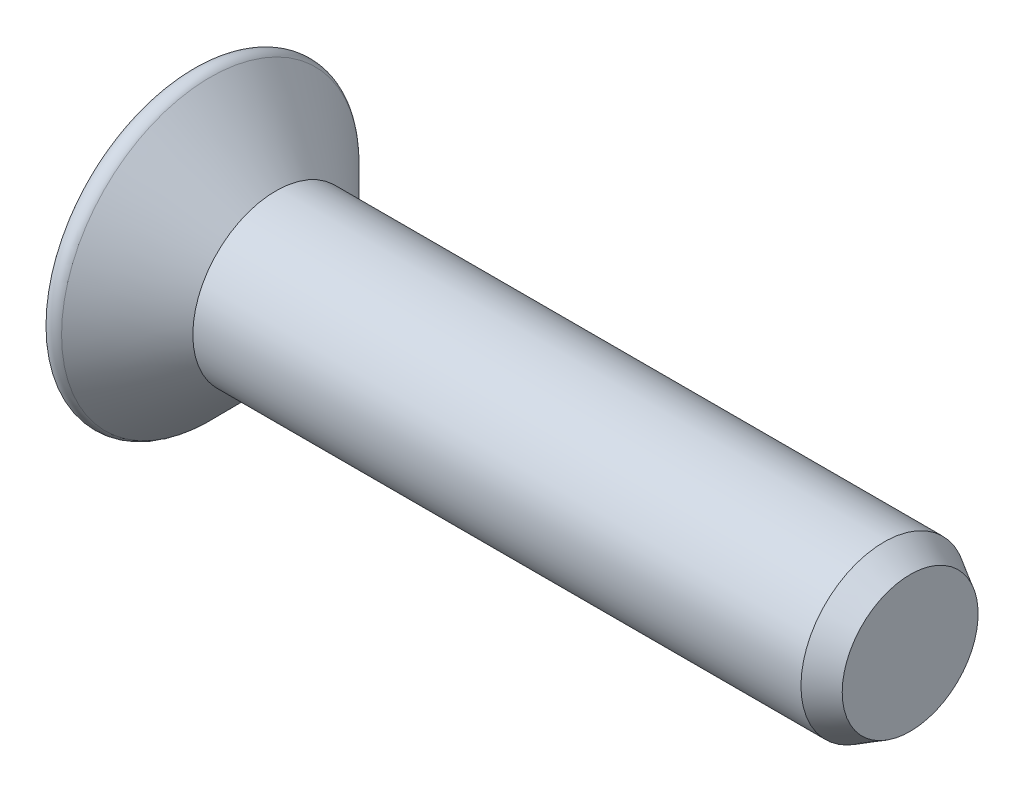
ISO-10303-21;
HEADER;
FILE_DESCRIPTION(('STEP AP214'),'2;1');
FILE_NAME('part.step','',(''),(''),'','','');
FILE_SCHEMA(('AUTOMOTIVE_DESIGN { 1 0 10303 214 1 1 1 1 }'));
ENDSEC;
DATA;
#1=APPLICATION_CONTEXT('core data for automotive mechanical design processes');
#2=APPLICATION_PROTOCOL_DEFINITION('international standard','automotive_design',2000,#1);
#3=PRODUCT_CONTEXT('',#1,'mechanical');
#4=PRODUCT('Part','Part','',(#3));
#5=PRODUCT_RELATED_PRODUCT_CATEGORY('part','',(#4));
#6=PRODUCT_DEFINITION_FORMATION('','',#4);
#7=PRODUCT_DEFINITION_CONTEXT('part definition',#1,'design');
#8=PRODUCT_DEFINITION('design','',#6,#7);
#9=PRODUCT_DEFINITION_SHAPE('','',#8);
#10=(LENGTH_UNIT() NAMED_UNIT(*) SI_UNIT(.MILLI.,.METRE.));
#11=(NAMED_UNIT(*) PLANE_ANGLE_UNIT() SI_UNIT($,.RADIAN.));
#12=(NAMED_UNIT(*) SI_UNIT($,.STERADIAN.) SOLID_ANGLE_UNIT());
#13=UNCERTAINTY_MEASURE_WITH_UNIT(LENGTH_MEASURE(1.E-05),#10,'distance_accuracy_value','');
#14=(GEOMETRIC_REPRESENTATION_CONTEXT(3) GLOBAL_UNCERTAINTY_ASSIGNED_CONTEXT((#13)) GLOBAL_UNIT_ASSIGNED_CONTEXT((#10,
#11,#12)) REPRESENTATION_CONTEXT('',''));
#15=CARTESIAN_POINT('',(0.,0.,0.));
#16=DIRECTION('',(0.,0.,1.));
#17=DIRECTION('',(1.,0.,0.));
#18=AXIS2_PLACEMENT_3D('',#15,#16,#17);
#19=CARTESIAN_POINT('',(2.4,0.,0.));
#20=DIRECTION('',(-1.,0.,0.));
#21=DIRECTION('',(0.,1.,0.));
#22=AXIS2_PLACEMENT_3D('',#19,#20,#21);
#23=SPHERICAL_SURFACE('',#22,4.);
#24=CARTESIAN_POINT('',(-1.1,0.,0.));
#25=DIRECTION('',(-1.,0.,0.));
#26=DIRECTION('',(0.,0.,1.));
#27=AXIS2_PLACEMENT_3D('',#24,#25,#26);
#28=CIRCLE('',#27,1.93649167310371);
#29=CARTESIAN_POINT('',(-1.1,0.,1.93649167310371));
#30=VERTEX_POINT('',#29);
#31=EDGE_CURVE('E186',#30,#30,#28,.T.);
#32=ORIENTED_EDGE('',*,*,#31,.T.);
#33=EDGE_LOOP('',(#32));
#34=FACE_BOUND('',#33,.T.);
#35=CARTESIAN_POINT('',(2.35629520146761,0.0815496745064481,0.407748372532241));
#36=DIRECTION('',(0.104528463267654,-0.195041790429927,-0.975208952149636));
#37=DIRECTION('',(0.,0.98058067569092,-0.196116135138184));
#38=AXIS2_PLACEMENT_3D('',#35,#36,#37);
#39=CIRCLE('',#38,3.97808758147309);
#40=CARTESIAN_POINT('',(-1.44518808804125,1.08372861238356,-0.200152097882818));
#41=VERTEX_POINT('',#40);
#42=CARTESIAN_POINT('',(-1.52998706959774,0.732056357032629,-0.138906885800055));
#43=VERTEX_POINT('',#42);
#44=EDGE_CURVE('E11',#41,#43,#39,.F.);
#45=ORIENTED_EDGE('',*,*,#44,.F.);
#46=CARTESIAN_POINT('',(2.47064663141738,0.672157798768073,0.));
#47=DIRECTION('',(0.104528463267654,0.994521895368273,0.));
#48=DIRECTION('',(-0.994521895368273,0.104528463267654,0.));
#49=AXIS2_PLACEMENT_3D('',#46,#47,#48);
#50=CIRCLE('',#49,3.94248816701136);
#51=CARTESIAN_POINT('',(-1.44518808804125,1.08372861238356,0.200152097882818));
#52=VERTEX_POINT('',#51);
#53=EDGE_CURVE('E42',#52,#41,#50,.F.);
#54=ORIENTED_EDGE('',*,*,#53,.F.);
#55=CARTESIAN_POINT('',(2.35629520146761,0.0815496745064482,-0.407748372532241));
#56=DIRECTION('',(0.104528463267654,-0.195041790429927,0.975208952149636));
#57=DIRECTION('',(0.,-0.98058067569092,-0.196116135138184));
#58=AXIS2_PLACEMENT_3D('',#55,#56,#57);
#59=CIRCLE('',#58,3.97808758147309);
#60=CARTESIAN_POINT('',(-1.52998706959774,0.732056357032629,0.138906885800055));
#61=VERTEX_POINT('',#60);
#62=EDGE_CURVE('E326',#61,#52,#59,.F.);
#63=ORIENTED_EDGE('',*,*,#62,.F.);
#64=CARTESIAN_POINT('',(2.40761651055694,0.0362331286540955,0.0627576197460744));
#65=DIRECTION('',(0.104528463267654,0.49726094768413,0.861281226008778));
#66=DIRECTION('',(0.,-0.866025403784443,0.499999999999993));
#67=AXIS2_PLACEMENT_3D('',#64,#65,#66);
#68=CIRCLE('',#67,3.99933627372326);
#69=CARTESIAN_POINT('',(-1.56766455428015,0.358913627986516,0.358913627986519));
#70=VERTEX_POINT('',#69);
#71=EDGE_CURVE('E324',#70,#61,#68,.F.);
#72=ORIENTED_EDGE('',*,*,#71,.F.);
#73=CARTESIAN_POINT('',(2.40761651055694,0.0627576197460732,0.0362331286540948));
#74=DIRECTION('',(0.104528463267654,0.861281226008778,0.497260947684129));
#75=DIRECTION('',(0.,-0.499999999999993,0.866025403784443));
#76=AXIS2_PLACEMENT_3D('',#73,#74,#75);
#77=CIRCLE('',#76,3.99933627372326);
#78=CARTESIAN_POINT('',(-1.52998706959774,0.138906885800052,0.732056357032632));
#79=VERTEX_POINT('',#78);
#80=EDGE_CURVE('E322',#79,#70,#77,.F.);
#81=ORIENTED_EDGE('',*,*,#80,.F.);
#82=CARTESIAN_POINT('',(2.35629520146761,-0.407748372532245,0.0815496745064493));
#83=DIRECTION('',(0.104528463267654,0.975208952149636,-0.195041790429928));
#84=DIRECTION('',(0.,0.196116135138185,0.98058067569092));
#85=AXIS2_PLACEMENT_3D('',#82,#83,#84);
#86=CIRCLE('',#85,3.97808758147309);
#87=CARTESIAN_POINT('',(-1.44518808804125,0.200152097882814,1.08372861238356));
#88=VERTEX_POINT('',#87);
#89=EDGE_CURVE('E320',#88,#79,#86,.F.);
#90=ORIENTED_EDGE('',*,*,#89,.F.);
#91=CARTESIAN_POINT('',(2.47064663141738,0.,0.672157798768076));
#92=DIRECTION('',(0.104528463267654,0.,0.994521895368273));
#93=DIRECTION('',(0.994521895368273,0.,-0.104528463267654));
#94=AXIS2_PLACEMENT_3D('',#91,#92,#93);
#95=CIRCLE('',#94,3.94248816701136);
#96=CARTESIAN_POINT('',(-1.44518808804125,-0.200152097882821,1.08372861238356));
#97=VERTEX_POINT('',#96);
#98=EDGE_CURVE('E318',#97,#88,#95,.F.);
#99=ORIENTED_EDGE('',*,*,#98,.F.);
#100=CARTESIAN_POINT('',(2.35629520146761,0.407748372532238,0.0815496745064475));
#101=DIRECTION('',(0.104528463267654,-0.975208952149636,-0.195041790429927));
#102=DIRECTION('',(0.,0.196116135138184,-0.98058067569092));
#103=AXIS2_PLACEMENT_3D('',#100,#101,#102);
#104=CIRCLE('',#103,3.97808758147309);
#105=CARTESIAN_POINT('',(-1.52998706959774,-0.138906885800059,0.732056357032632));
#106=VERTEX_POINT('',#105);
#107=EDGE_CURVE('E316',#106,#97,#104,.F.);
#108=ORIENTED_EDGE('',*,*,#107,.F.);
#109=CARTESIAN_POINT('',(2.40761651055694,-0.0627576197460781,0.0362331286540976));
#110=DIRECTION('',(0.104528463267654,-0.861281226008779,0.497260947684129));
#111=DIRECTION('',(0.,-0.499999999999992,-0.866025403784443));
#112=AXIS2_PLACEMENT_3D('',#109,#110,#111);
#113=CIRCLE('',#112,3.99933627372326);
#114=CARTESIAN_POINT('',(-1.56766455428015,-0.358913627986523,0.358913627986519));
#115=VERTEX_POINT('',#114);
#116=EDGE_CURVE('E314',#115,#106,#113,.F.);
#117=ORIENTED_EDGE('',*,*,#116,.F.);
#118=CARTESIAN_POINT('',(2.40761651055694,-0.0362331286540969,0.0627576197460769));
#119=DIRECTION('',(0.104528463267654,-0.497260947684129,0.861281226008779));
#120=DIRECTION('',(0.,-0.866025403784443,-0.499999999999992));
#121=AXIS2_PLACEMENT_3D('',#118,#119,#120);
#122=CIRCLE('',#121,3.99933627372326);
#123=CARTESIAN_POINT('',(-1.52998706959774,-0.732056357032635,0.138906885800055));
#124=VERTEX_POINT('',#123);
#125=EDGE_CURVE('E312',#124,#115,#122,.F.);
#126=ORIENTED_EDGE('',*,*,#125,.F.);
#127=CARTESIAN_POINT('',(2.35629520146761,-0.0815496745064481,-0.407748372532242));
#128=DIRECTION('',(0.104528463267654,0.195041790429927,0.975208952149636));
#129=DIRECTION('',(0.,-0.98058067569092,0.196116135138183));
#130=AXIS2_PLACEMENT_3D('',#127,#128,#129);
#131=CIRCLE('',#130,3.97808758147309);
#132=CARTESIAN_POINT('',(-1.44518808804125,-1.08372861238356,0.200152097882817));
#133=VERTEX_POINT('',#132);
#134=EDGE_CURVE('E310',#133,#124,#131,.F.);
#135=ORIENTED_EDGE('',*,*,#134,.F.);
#136=CARTESIAN_POINT('',(2.47064663141738,-0.672157798768079,0.));
#137=DIRECTION('',(0.104528463267654,-0.994521895368273,0.));
#138=DIRECTION('',(0.994521895368273,0.104528463267654,0.));
#139=AXIS2_PLACEMENT_3D('',#136,#137,#138);
#140=CIRCLE('',#139,3.94248816701136);
#141=CARTESIAN_POINT('',(-1.44518808804125,-1.08372861238356,-0.200152097882818));
#142=VERTEX_POINT('',#141);
#143=EDGE_CURVE('E308',#142,#133,#140,.F.);
#144=ORIENTED_EDGE('',*,*,#143,.F.);
#145=CARTESIAN_POINT('',(2.35629520146761,-0.0815496745064491,0.407748372532243));
#146=DIRECTION('',(0.104528463267654,0.195041790429928,-0.975208952149636));
#147=DIRECTION('',(0.,0.98058067569092,0.196116135138185));
#148=AXIS2_PLACEMENT_3D('',#145,#146,#147);
#149=CIRCLE('',#148,3.97808758147309);
#150=CARTESIAN_POINT('',(-1.52998706959774,-0.732056357032635,-0.138906885800055));
#151=VERTEX_POINT('',#150);
#152=EDGE_CURVE('E306',#151,#142,#149,.F.);
#153=ORIENTED_EDGE('',*,*,#152,.F.);
#154=CARTESIAN_POINT('',(2.40761651055694,-0.0362331286540972,-0.0627576197460774));
#155=DIRECTION('',(0.104528463267654,-0.497260947684129,-0.861281226008779));
#156=DIRECTION('',(0.,0.866025403784443,-0.499999999999992));
#157=AXIS2_PLACEMENT_3D('',#154,#155,#156);
#158=CIRCLE('',#157,3.99933627372326);
#159=CARTESIAN_POINT('',(-1.56766455428015,-0.358913627986523,-0.358913627986519));
#160=VERTEX_POINT('',#159);
#161=EDGE_CURVE('E304',#160,#151,#158,.F.);
#162=ORIENTED_EDGE('',*,*,#161,.F.);
#163=CARTESIAN_POINT('',(2.40761651055694,-0.0627576197460786,-0.036233128654098));
#164=DIRECTION('',(0.104528463267654,-0.861281226008778,-0.497260947684129));
#165=DIRECTION('',(0.,0.499999999999993,-0.866025403784443));
#166=AXIS2_PLACEMENT_3D('',#163,#164,#165);
#167=CIRCLE('',#166,3.99933627372326);
#168=CARTESIAN_POINT('',(-1.52998706959774,-0.138906885800058,-0.732056357032632));
#169=VERTEX_POINT('',#168);
#170=EDGE_CURVE('E302',#169,#160,#167,.F.);
#171=ORIENTED_EDGE('',*,*,#170,.F.);
#172=CARTESIAN_POINT('',(2.35629520146761,0.407748372532237,-0.0815496745064468));
#173=DIRECTION('',(0.104528463267654,-0.975208952149636,0.195041790429926));
#174=DIRECTION('',(0.,-0.196116135138183,-0.980580675690921));
#175=AXIS2_PLACEMENT_3D('',#172,#173,#174);
#176=CIRCLE('',#175,3.97808758147309);
#177=CARTESIAN_POINT('',(-1.44518808804125,-0.200152097882821,-1.08372861238356));
#178=VERTEX_POINT('',#177);
#179=EDGE_CURVE('E300',#178,#169,#176,.F.);
#180=ORIENTED_EDGE('',*,*,#179,.F.);
#181=CARTESIAN_POINT('',(2.47064663141738,0.,-0.672157798768077));
#182=DIRECTION('',(0.104528463267654,0.,-0.994521895368273));
#183=DIRECTION('',(-0.994521895368273,0.,-0.104528463267654));
#184=AXIS2_PLACEMENT_3D('',#181,#182,#183);
#185=CIRCLE('',#184,3.94248816701136);
#186=CARTESIAN_POINT('',(-1.44518808804125,0.200152097882815,-1.08372861238356));
#187=VERTEX_POINT('',#186);
#188=EDGE_CURVE('E298',#187,#178,#185,.F.);
#189=ORIENTED_EDGE('',*,*,#188,.F.);
#190=CARTESIAN_POINT('',(2.35629520146761,-0.407748372532246,-0.0815496745064499));
#191=DIRECTION('',(0.104528463267654,0.975208952149636,0.195041790429929));
#192=DIRECTION('',(0.,-0.196116135138186,0.98058067569092));
#193=AXIS2_PLACEMENT_3D('',#190,#191,#192);
#194=CIRCLE('',#193,3.97808758147309);
#195=CARTESIAN_POINT('',(-1.52998706959774,0.138906885800052,-0.732056357032632));
#196=VERTEX_POINT('',#195);
#197=EDGE_CURVE('E296',#196,#187,#194,.F.);
#198=ORIENTED_EDGE('',*,*,#197,.F.);
#199=CARTESIAN_POINT('',(2.40761651055694,0.0627576197460731,-0.0362331286540947));
#200=DIRECTION('',(0.104528463267654,0.861281226008779,-0.497260947684128));
#201=DIRECTION('',(0.,0.499999999999992,0.866025403784443));
#202=AXIS2_PLACEMENT_3D('',#199,#200,#201);
#203=CIRCLE('',#202,3.99933627372326);
#204=CARTESIAN_POINT('',(-1.56766455428015,0.358913627986516,-0.358913627986519));
#205=VERTEX_POINT('',#204);
#206=EDGE_CURVE('E294',#205,#196,#203,.F.);
#207=ORIENTED_EDGE('',*,*,#206,.F.);
#208=CARTESIAN_POINT('',(2.40761651055694,0.0362331286540954,-0.0627576197460743));
#209=DIRECTION('',(0.104528463267654,0.497260947684129,-0.861281226008779));
#210=DIRECTION('',(0.,0.866025403784443,0.499999999999992));
#211=AXIS2_PLACEMENT_3D('',#208,#209,#210);
#212=CIRCLE('',#211,3.99933627372326);
#213=EDGE_CURVE('E292',#43,#205,#212,.F.);
#214=ORIENTED_EDGE('',*,*,#213,.F.);
#215=EDGE_LOOP('',(#45,#54,#63,#72,#81,#90,#99,#108,#117,#126,#135,#144,#153,#162,#171,#180,
#189,#198,#207,#214));
#216=FACE_BOUND('',#215,.T.);
#217=ADVANCED_FACE('F34',(#34,#216),#23,.T.);
#218=CARTESIAN_POINT('',(-0.972266920894951,0.,0.));
#219=DIRECTION('',(-1.,0.,0.));
#220=DIRECTION('',(0.,0.,1.));
#221=AXIS2_PLACEMENT_3D('',#218,#219,#220);
#222=TOROIDAL_SURFACE('',#221,1.86581908908461,0.145980661834342);
#223=ORIENTED_EDGE('',*,*,#31,.F.);
#224=EDGE_LOOP('',(#223));
#225=FACE_BOUND('',#224,.T.);
#226=CARTESIAN_POINT('',(-0.869043004989789,0.,0.));
#227=DIRECTION('',(-1.,0.,0.));
#228=DIRECTION('',(0.,0.,1.));
#229=AXIS2_PLACEMENT_3D('',#226,#227,#228);
#230=CIRCLE('',#229,1.96904300498978);
#231=CARTESIAN_POINT('',(-0.869043004989789,0.,1.96904300498978));
#232=VERTEX_POINT('',#231);
#233=EDGE_CURVE('E283',#232,#232,#230,.T.);
#234=ORIENTED_EDGE('',*,*,#233,.T.);
#235=EDGE_LOOP('',(#234));
#236=FACE_BOUND('',#235,.T.);
#237=ADVANCED_FACE('F422',(#225,#236),#222,.T.);
#238=CARTESIAN_POINT('',(0.,0.,0.));
#239=DIRECTION('',(-1.,0.,0.));
#240=DIRECTION('',(0.,0.,1.));
#241=AXIS2_PLACEMENT_3D('',#238,#239,#240);
#242=CONICAL_SURFACE('',#241,1.1,0.785398163397443);
#243=ORIENTED_EDGE('',*,*,#233,.F.);
#244=EDGE_LOOP('',(#243));
#245=FACE_BOUND('',#244,.T.);
#246=CARTESIAN_POINT('',(0.,0.,0.));
#247=DIRECTION('',(-1.,0.,0.));
#248=DIRECTION('',(0.,0.,1.));
#249=AXIS2_PLACEMENT_3D('',#246,#247,#248);
#250=CIRCLE('',#249,1.1);
#251=CARTESIAN_POINT('',(0.,0.,1.1));
#252=VERTEX_POINT('',#251);
#253=EDGE_CURVE('E190',#252,#252,#250,.T.);
#254=ORIENTED_EDGE('',*,*,#253,.T.);
#255=EDGE_LOOP('',(#254));
#256=FACE_BOUND('',#255,.T.);
#257=ADVANCED_FACE('F428',(#245,#256),#242,.T.);
#258=CARTESIAN_POINT('',(0.,0.,0.));
#259=DIRECTION('',(-1.,0.,0.));
#260=DIRECTION('',(0.,0.,1.));
#261=AXIS2_PLACEMENT_3D('',#258,#259,#260);
#262=CYLINDRICAL_SURFACE('',#261,1.1);
#263=CARTESIAN_POINT('',(8.05358983848622,0.,0.));
#264=DIRECTION('',(-1.,0.,0.));
#265=DIRECTION('',(0.,0.,1.));
#266=AXIS2_PLACEMENT_3D('',#263,#264,#265);
#267=CIRCLE('',#266,1.1);
#268=CARTESIAN_POINT('',(8.05358983848622,0.,1.1));
#269=VERTEX_POINT('',#268);
#270=EDGE_CURVE('E286',#269,#269,#267,.T.);
#271=ORIENTED_EDGE('',*,*,#270,.T.);
#272=EDGE_LOOP('',(#271));
#273=FACE_BOUND('',#272,.T.);
#274=ORIENTED_EDGE('',*,*,#253,.F.);
#275=EDGE_LOOP('',(#274));
#276=FACE_BOUND('',#275,.T.);
#277=ADVANCED_FACE('F435',(#273,#276),#262,.T.);
#278=CARTESIAN_POINT('',(8.4,1.1,0.));
#279=DIRECTION('',(-1.,0.,0.));
#280=DIRECTION('',(0.,0.,1.));
#281=AXIS2_PLACEMENT_3D('',#278,#279,#280);
#282=PLANE('',#281);
#283=CARTESIAN_POINT('',(8.4,0.,0.));
#284=DIRECTION('',(-1.,0.,0.));
#285=DIRECTION('',(0.,0.,1.));
#286=AXIS2_PLACEMENT_3D('',#283,#284,#285);
#287=CIRCLE('',#286,0.899999999999997);
#288=CARTESIAN_POINT('',(8.4,0.,0.899999999999997));
#289=VERTEX_POINT('',#288);
#290=EDGE_CURVE('E289',#289,#289,#287,.F.);
#291=ORIENTED_EDGE('',*,*,#290,.T.);
#292=EDGE_LOOP('',(#291));
#293=FACE_BOUND('',#292,.T.);
#294=ADVANCED_FACE('F432',(#293),#282,.F.);
#295=CARTESIAN_POINT('',(8.05358983848622,0.,0.));
#296=DIRECTION('',(-1.,0.,0.));
#297=DIRECTION('',(0.,0.,1.));
#298=AXIS2_PLACEMENT_3D('',#295,#296,#297);
#299=CONICAL_SURFACE('',#298,1.1,0.523598775598297);
#300=ORIENTED_EDGE('',*,*,#290,.F.);
#301=EDGE_LOOP('',(#300));
#302=FACE_BOUND('',#301,.T.);
#303=ORIENTED_EDGE('',*,*,#270,.F.);
#304=EDGE_LOOP('',(#303));
#305=FACE_BOUND('',#304,.T.);
#306=ADVANCED_FACE('F36',(#302,#305),#299,.T.);
#307=CARTESIAN_POINT('',(-1.6,1.1,-0.22));
#308=DIRECTION('',(0.104528463267654,-0.195041790429927,-0.975208952149636));
#309=DIRECTION('',(0.,0.98058067569092,-0.196116135138184));
#310=AXIS2_PLACEMENT_3D('',#307,#308,#309);
#311=PLANE('',#310);
#312=ORIENTED_EDGE('',*,*,#44,.T.);
#313=DIRECTION('',(-0.993750702543819,0.0181251675749864,-0.110140907450615));
#314=VECTOR('',#313,1.);
#315=CARTESIAN_POINT('',(-1.6,0.733333333333333,-0.146666666666667));
#316=LINE('',#315,#314);
#317=CARTESIAN_POINT('',(-0.8,0.718742013777159,-0.0579998353024829));
#318=VERTEX_POINT('',#317);
#319=EDGE_CURVE('E49',#318,#43,#316,.T.);
#320=ORIENTED_EDGE('',*,*,#319,.F.);
#321=DIRECTION('',(0.,-0.98058067569092,0.196116135138184));
#322=VECTOR('',#321,1.);
#323=CARTESIAN_POINT('',(-0.8,0.0164901091255632,0.0824505456278361));
#324=LINE('',#323,#322);
#325=CARTESIAN_POINT('',(-0.8,1.01591661178746,-0.117434754904543));
#326=VERTEX_POINT('',#325);
#327=EDGE_CURVE('E175',#318,#326,#324,.F.);
#328=ORIENTED_EDGE('',*,*,#327,.T.);
#329=DIRECTION('',(-0.986535014171401,0.103689008227299,-0.126480256904675));
#330=VECTOR('',#329,1.);
#331=CARTESIAN_POINT('',(-1.54509803110334,1.09422957054454,-0.212961207629864));
#332=LINE('',#331,#330);
#333=EDGE_CURVE('E182',#326,#41,#332,.T.);
#334=ORIENTED_EDGE('',*,*,#333,.T.);
#335=EDGE_LOOP('',(#312,#320,#328,#334));
#336=FACE_BOUND('',#335,.T.);
#337=ADVANCED_FACE('F181',(#336),#311,.F.);
#338=CARTESIAN_POINT('',(-1.6,1.1,0.22));
#339=DIRECTION('',(0.104528463267654,0.994521895368273,0.));
#340=DIRECTION('',(-0.994521895368273,0.104528463267654,0.));
#341=AXIS2_PLACEMENT_3D('',#338,#339,#340);
#342=PLANE('',#341);
#343=ORIENTED_EDGE('',*,*,#53,.T.);
#344=ORIENTED_EDGE('',*,*,#333,.F.);
#345=DIRECTION('',(0.,0.,-1.));
#346=VECTOR('',#345,1.);
#347=CARTESIAN_POINT('',(-0.8,1.01591661178746,0.));
#348=LINE('',#347,#346);
#349=CARTESIAN_POINT('',(-0.8,1.01591661178746,0.117434754904542));
#350=VERTEX_POINT('',#349);
#351=EDGE_CURVE('E171',#326,#350,#348,.F.);
#352=ORIENTED_EDGE('',*,*,#351,.T.);
#353=DIRECTION('',(-0.986535014171401,0.103689008227299,0.126480256904675));
#354=VECTOR('',#353,1.);
#355=CARTESIAN_POINT('',(-1.6,1.1,0.22));
#356=LINE('',#355,#354);
#357=EDGE_CURVE('E187',#350,#52,#356,.T.);
#358=ORIENTED_EDGE('',*,*,#357,.T.);
#359=EDGE_LOOP('',(#343,#344,#352,#358));
#360=FACE_BOUND('',#359,.T.);
#361=ADVANCED_FACE('F185',(#360),#342,.F.);
#362=CARTESIAN_POINT('',(-1.6,1.1,0.22));
#363=DIRECTION('',(0.104528463267654,-0.195041790429927,0.975208952149636));
#364=DIRECTION('',(0.,-0.98058067569092,-0.196116135138184));
#365=AXIS2_PLACEMENT_3D('',#362,#363,#364);
#366=PLANE('',#365);
#367=ORIENTED_EDGE('',*,*,#62,.T.);
#368=ORIENTED_EDGE('',*,*,#357,.F.);
#369=DIRECTION('',(0.,0.98058067569092,0.196116135138184));
#370=VECTOR('',#369,1.);
#371=CARTESIAN_POINT('',(-0.8,0.0164901091255635,-0.0824505456278365));
#372=LINE('',#371,#370);
#373=CARTESIAN_POINT('',(-0.8,0.718742013777159,0.0579998353024826));
#374=VERTEX_POINT('',#373);
#375=EDGE_CURVE('E177',#350,#374,#372,.F.);
#376=ORIENTED_EDGE('',*,*,#375,.T.);
#377=DIRECTION('',(-0.993750702543819,0.0181251675749865,0.110140907450615));
#378=VECTOR('',#377,1.);
#379=CARTESIAN_POINT('',(-1.61463088690908,0.733600188266184,0.148288259644511));
#380=LINE('',#379,#378);
#381=EDGE_CURVE('E192',#374,#61,#380,.T.);
#382=ORIENTED_EDGE('',*,*,#381,.T.);
#383=EDGE_LOOP('',(#367,#368,#376,#382));
#384=FACE_BOUND('',#383,.T.);
#385=ADVANCED_FACE('F329',(#384),#366,.F.);
#386=CARTESIAN_POINT('',(-1.6,0.733333333333333,0.146666666666667));
#387=DIRECTION('',(0.104528463267654,0.49726094768413,0.861281226008778));
#388=DIRECTION('',(0.,-0.866025403784443,0.499999999999993));
#389=AXIS2_PLACEMENT_3D('',#386,#387,#388);
#390=PLANE('',#389);
#391=ORIENTED_EDGE('',*,*,#71,.T.);
#392=ORIENTED_EDGE('',*,*,#381,.F.);
#393=DIRECTION('',(0.,0.866025403784443,-0.499999999999993));
#394=VECTOR('',#393,1.);
#395=CARTESIAN_POINT('',(-0.8,0.204800168837913,0.354724297825963));
#396=LINE('',#395,#394);
#397=CARTESIAN_POINT('',(-0.8,0.29984825797608,0.299848257976084));
#398=VERTEX_POINT('',#397);
#399=EDGE_CURVE('E248',#374,#398,#396,.F.);
#400=ORIENTED_EDGE('',*,*,#399,.T.);
#401=DIRECTION('',(-0.994132040497618,0.0764901498757906,0.0764901498757906));
#402=VECTOR('',#401,1.);
#403=CARTESIAN_POINT('',(-1.61195345493607,0.362321288650294,0.362321288650298));
#404=LINE('',#403,#402);
#405=EDGE_CURVE('E242',#398,#70,#404,.T.);
#406=ORIENTED_EDGE('',*,*,#405,.T.);
#407=EDGE_LOOP('',(#391,#392,#400,#406));
#408=FACE_BOUND('',#407,.T.);
#409=ADVANCED_FACE('F412',(#408),#390,.F.);
#410=CARTESIAN_POINT('',(-1.6,0.146666666666663,0.733333333333336));
#411=DIRECTION('',(0.104528463267654,0.861281226008778,0.497260947684129));
#412=DIRECTION('',(0.,-0.499999999999993,0.866025403784443));
#413=AXIS2_PLACEMENT_3D('',#410,#411,#412);
#414=PLANE('',#413);
#415=ORIENTED_EDGE('',*,*,#80,.T.);
#416=ORIENTED_EDGE('',*,*,#405,.F.);
#417=DIRECTION('',(0.,0.499999999999993,-0.866025403784443));
#418=VECTOR('',#417,1.);
#419=CARTESIAN_POINT('',(-0.8,0.354724297825959,0.204800168837917));
#420=LINE('',#419,#418);
#421=CARTESIAN_POINT('',(-0.8,0.0579998353024793,0.718742013777162));
#422=VERTEX_POINT('',#421);
#423=EDGE_CURVE('E250',#398,#422,#420,.F.);
#424=ORIENTED_EDGE('',*,*,#423,.T.);
#425=DIRECTION('',(-0.993750702543819,0.110140907450615,0.0181251675749864));
#426=VECTOR('',#425,1.);
#427=CARTESIAN_POINT('',(-1.6,0.146666666666663,0.733333333333336));
#428=LINE('',#427,#426);
#429=EDGE_CURVE('E239',#422,#79,#428,.T.);
#430=ORIENTED_EDGE('',*,*,#429,.T.);
#431=EDGE_LOOP('',(#415,#416,#424,#430));
#432=FACE_BOUND('',#431,.T.);
#433=ADVANCED_FACE('F409',(#432),#414,.F.);
#434=CARTESIAN_POINT('',(-1.6,0.219999999999997,1.1));
#435=DIRECTION('',(0.104528463267654,0.975208952149636,-0.195041790429928));
#436=DIRECTION('',(0.,0.196116135138185,0.98058067569092));
#437=AXIS2_PLACEMENT_3D('',#434,#435,#436);
#438=PLANE('',#437);
#439=ORIENTED_EDGE('',*,*,#89,.T.);
#440=ORIENTED_EDGE('',*,*,#429,.F.);
#441=DIRECTION('',(0.,-0.196116135138185,-0.98058067569092));
#442=VECTOR('',#441,1.);
#443=CARTESIAN_POINT('',(-0.8,-0.0824505456278401,0.0164901091255677));
#444=LINE('',#443,#442);
#445=CARTESIAN_POINT('',(-0.8,0.117434754904539,1.01591661178746));
#446=VERTEX_POINT('',#445);
#447=EDGE_CURVE('E252',#422,#446,#444,.F.);
#448=ORIENTED_EDGE('',*,*,#447,.T.);
#449=DIRECTION('',(-0.986535014171401,0.126480256904676,0.103689008227299));
#450=VECTOR('',#449,1.);
#451=CARTESIAN_POINT('',(-1.54509803110334,0.212961207629861,1.09422957054454));
#452=LINE('',#451,#450);
#453=EDGE_CURVE('E236',#446,#88,#452,.T.);
#454=ORIENTED_EDGE('',*,*,#453,.T.);
#455=EDGE_LOOP('',(#439,#440,#448,#454));
#456=FACE_BOUND('',#455,.T.);
#457=ADVANCED_FACE('F406',(#456),#438,.F.);
#458=CARTESIAN_POINT('',(-1.6,-0.220000000000003,1.1));
#459=DIRECTION('',(0.104528463267654,0.,0.994521895368273));
#460=DIRECTION('',(0.994521895368273,0.,-0.104528463267654));
#461=AXIS2_PLACEMENT_3D('',#458,#459,#460);
#462=PLANE('',#461);
#463=ORIENTED_EDGE('',*,*,#98,.T.);
#464=ORIENTED_EDGE('',*,*,#453,.F.);
#465=DIRECTION('',(0.,1.,0.));
#466=VECTOR('',#465,1.);
#467=CARTESIAN_POINT('',(-0.8,0.,1.01591661178746));
#468=LINE('',#467,#466);
#469=CARTESIAN_POINT('',(-0.8,-0.117434754904546,1.01591661178746));
#470=VERTEX_POINT('',#469);
#471=EDGE_CURVE('E254',#446,#470,#468,.F.);
#472=ORIENTED_EDGE('',*,*,#471,.T.);
#473=DIRECTION('',(-0.986535014171401,-0.126480256904675,0.103689008227299));
#474=VECTOR('',#473,1.);
#475=CARTESIAN_POINT('',(-1.6,-0.220000000000003,1.1));
#476=LINE('',#475,#474);
#477=EDGE_CURVE('E233',#470,#97,#476,.T.);
#478=ORIENTED_EDGE('',*,*,#477,.T.);
#479=EDGE_LOOP('',(#463,#464,#472,#478));
#480=FACE_BOUND('',#479,.T.);
#481=ADVANCED_FACE('F399',(#480),#462,.F.);
#482=CARTESIAN_POINT('',(-1.6,-0.220000000000003,1.1));
#483=DIRECTION('',(0.104528463267654,-0.975208952149636,-0.195041790429927));
#484=DIRECTION('',(0.,0.196116135138184,-0.98058067569092));
#485=AXIS2_PLACEMENT_3D('',#482,#483,#484);
#486=PLANE('',#485);
#487=ORIENTED_EDGE('',*,*,#107,.T.);
#488=ORIENTED_EDGE('',*,*,#477,.F.);
#489=DIRECTION('',(0.,-0.196116135138184,0.98058067569092));
#490=VECTOR('',#489,1.);
#491=CARTESIAN_POINT('',(-0.8,0.0824505456278325,0.0164901091255677));
#492=LINE('',#491,#490);
#493=CARTESIAN_POINT('',(-0.8,-0.0579998353024862,0.718742013777162));
#494=VERTEX_POINT('',#493);
#495=EDGE_CURVE('E256',#470,#494,#492,.F.);
#496=ORIENTED_EDGE('',*,*,#495,.T.);
#497=DIRECTION('',(-0.993750702543819,-0.110140907450615,0.0181251675749864));
#498=VECTOR('',#497,1.);
#499=CARTESIAN_POINT('',(-1.61463088690908,-0.148288259644515,0.733600188266187));
#500=LINE('',#499,#498);
#501=EDGE_CURVE('E230',#494,#106,#500,.T.);
#502=ORIENTED_EDGE('',*,*,#501,.T.);
#503=EDGE_LOOP('',(#487,#488,#496,#502));
#504=FACE_BOUND('',#503,.T.);
#505=ADVANCED_FACE('F397',(#504),#486,.F.);
#506=CARTESIAN_POINT('',(-1.6,-0.14666666666667,0.733333333333336));
#507=DIRECTION('',(0.104528463267654,-0.861281226008779,0.497260947684129));
#508=DIRECTION('',(0.,-0.499999999999992,-0.866025403784443));
#509=AXIS2_PLACEMENT_3D('',#506,#507,#508);
#510=PLANE('',#509);
#511=ORIENTED_EDGE('',*,*,#116,.T.);
#512=ORIENTED_EDGE('',*,*,#501,.F.);
#513=DIRECTION('',(0.,0.499999999999992,0.866025403784443));
#514=VECTOR('',#513,1.);
#515=CARTESIAN_POINT('',(-0.8,-0.354724297825966,0.204800168837916));
#516=LINE('',#515,#514);
#517=CARTESIAN_POINT('',(-0.8,-0.299848257976087,0.299848257976083));
#518=VERTEX_POINT('',#517);
#519=EDGE_CURVE('E258',#494,#518,#516,.F.);
#520=ORIENTED_EDGE('',*,*,#519,.T.);
#521=DIRECTION('',(-0.994132040497618,-0.0764901498757907,0.0764901498757907));
#522=VECTOR('',#521,1.);
#523=CARTESIAN_POINT('',(-1.61195345493607,-0.362321288650301,0.362321288650297));
#524=LINE('',#523,#522);
#525=EDGE_CURVE('E227',#518,#115,#524,.T.);
#526=ORIENTED_EDGE('',*,*,#525,.T.);
#527=EDGE_LOOP('',(#511,#512,#520,#526));
#528=FACE_BOUND('',#527,.T.);
#529=ADVANCED_FACE('F390',(#528),#510,.F.);
#530=CARTESIAN_POINT('',(-1.6,-0.73333333333334,0.146666666666666));
#531=DIRECTION('',(0.104528463267654,-0.497260947684129,0.861281226008779));
#532=DIRECTION('',(0.,-0.866025403784443,-0.499999999999992));
#533=AXIS2_PLACEMENT_3D('',#530,#531,#532);
#534=PLANE('',#533);
#535=ORIENTED_EDGE('',*,*,#125,.T.);
#536=ORIENTED_EDGE('',*,*,#525,.F.);
#537=DIRECTION('',(0.,0.866025403784443,0.499999999999992));
#538=VECTOR('',#537,1.);
#539=CARTESIAN_POINT('',(-0.8,-0.20480016883792,0.354724297825963));
#540=LINE('',#539,#538);
#541=CARTESIAN_POINT('',(-0.8,-0.718742013777166,0.0579998353024825));
#542=VERTEX_POINT('',#541);
#543=EDGE_CURVE('E260',#518,#542,#540,.F.);
#544=ORIENTED_EDGE('',*,*,#543,.T.);
#545=DIRECTION('',(-0.993750702543819,-0.0181251675749865,0.110140907450615));
#546=VECTOR('',#545,1.);
#547=CARTESIAN_POINT('',(-1.6,-0.73333333333334,0.146666666666666));
#548=LINE('',#547,#546);
#549=EDGE_CURVE('E224',#542,#124,#548,.T.);
#550=ORIENTED_EDGE('',*,*,#549,.T.);
#551=EDGE_LOOP('',(#535,#536,#544,#550));
#552=FACE_BOUND('',#551,.T.);
#553=ADVANCED_FACE('F387',(#552),#534,.F.);
#554=CARTESIAN_POINT('',(-1.6,-1.10000000000001,0.219999999999999));
#555=DIRECTION('',(0.104528463267654,0.195041790429927,0.975208952149636));
#556=DIRECTION('',(0.,-0.98058067569092,0.196116135138183));
#557=AXIS2_PLACEMENT_3D('',#554,#555,#556);
#558=PLANE('',#557);
#559=ORIENTED_EDGE('',*,*,#134,.T.);
#560=ORIENTED_EDGE('',*,*,#549,.F.);
#561=DIRECTION('',(0.,0.98058067569092,-0.196116135138183));
#562=VECTOR('',#561,1.);
#563=CARTESIAN_POINT('',(-0.8,-0.0164901091255711,-0.082450545627836));
#564=LINE('',#563,#562);
#565=CARTESIAN_POINT('',(-0.8,-1.01591661178746,0.117434754904542));
#566=VERTEX_POINT('',#565);
#567=EDGE_CURVE('E262',#542,#566,#564,.F.);
#568=ORIENTED_EDGE('',*,*,#567,.T.);
#569=DIRECTION('',(-0.986535014171401,-0.103689008227299,0.126480256904675));
#570=VECTOR('',#569,1.);
#571=CARTESIAN_POINT('',(-1.54509803110334,-1.09422957054454,0.212961207629863));
#572=LINE('',#571,#570);
#573=EDGE_CURVE('E221',#566,#133,#572,.T.);
#574=ORIENTED_EDGE('',*,*,#573,.T.);
#575=EDGE_LOOP('',(#559,#560,#568,#574));
#576=FACE_BOUND('',#575,.T.);
#577=ADVANCED_FACE('F379',(#576),#558,.F.);
#578=CARTESIAN_POINT('',(-1.6,-1.10000000000001,-0.220000000000001));
#579=DIRECTION('',(0.104528463267654,-0.994521895368273,0.));
#580=DIRECTION('',(0.994521895368273,0.104528463267654,0.));
#581=AXIS2_PLACEMENT_3D('',#578,#579,#580);
#582=PLANE('',#581);
#583=ORIENTED_EDGE('',*,*,#143,.T.);
#584=ORIENTED_EDGE('',*,*,#573,.F.);
#585=DIRECTION('',(0.,0.,1.));
#586=VECTOR('',#585,1.);
#587=CARTESIAN_POINT('',(-0.8,-1.01591661178746,0.));
#588=LINE('',#587,#586);
#589=CARTESIAN_POINT('',(-0.8,-1.01591661178746,-0.117434754904543));
#590=VERTEX_POINT('',#589);
#591=EDGE_CURVE('E264',#566,#590,#588,.F.);
#592=ORIENTED_EDGE('',*,*,#591,.T.);
#593=DIRECTION('',(-0.986535014171401,-0.103689008227299,-0.126480256904676));
#594=VECTOR('',#593,1.);
#595=CARTESIAN_POINT('',(-1.6,-1.10000000000001,-0.220000000000001));
#596=LINE('',#595,#594);
#597=EDGE_CURVE('E218',#590,#142,#596,.T.);
#598=ORIENTED_EDGE('',*,*,#597,.T.);
#599=EDGE_LOOP('',(#583,#584,#592,#598));
#600=FACE_BOUND('',#599,.T.);
#601=ADVANCED_FACE('F377',(#600),#582,.F.);
#602=CARTESIAN_POINT('',(-1.6,-1.10000000000001,-0.220000000000001));
#603=DIRECTION('',(0.104528463267654,0.195041790429928,-0.975208952149636));
#604=DIRECTION('',(0.,0.98058067569092,0.196116135138185));
#605=AXIS2_PLACEMENT_3D('',#602,#603,#604);
#606=PLANE('',#605);
#607=ORIENTED_EDGE('',*,*,#152,.T.);
#608=ORIENTED_EDGE('',*,*,#597,.F.);
#609=DIRECTION('',(0.,-0.98058067569092,-0.196116135138185));
#610=VECTOR('',#609,1.);
#611=CARTESIAN_POINT('',(-0.8,-0.0164901091255713,0.0824505456278369));
#612=LINE('',#611,#610);
#613=CARTESIAN_POINT('',(-0.8,-0.718742013777166,-0.057999835302483));
#614=VERTEX_POINT('',#613);
#615=EDGE_CURVE('E266',#590,#614,#612,.F.);
#616=ORIENTED_EDGE('',*,*,#615,.T.);
#617=DIRECTION('',(-0.993750702543819,-0.0181251675749864,-0.110140907450615));
#618=VECTOR('',#617,1.);
#619=CARTESIAN_POINT('',(-1.61463088690908,-0.733600188266191,-0.148288259644512));
#620=LINE('',#619,#618);
#621=EDGE_CURVE('E215',#614,#151,#620,.T.);
#622=ORIENTED_EDGE('',*,*,#621,.T.);
#623=EDGE_LOOP('',(#607,#608,#616,#622));
#624=FACE_BOUND('',#623,.T.);
#625=ADVANCED_FACE('F370',(#624),#606,.F.);
#626=CARTESIAN_POINT('',(-1.6,-0.73333333333334,-0.146666666666667));
#627=DIRECTION('',(0.104528463267654,-0.497260947684129,-0.861281226008779));
#628=DIRECTION('',(0.,0.866025403784443,-0.499999999999992));
#629=AXIS2_PLACEMENT_3D('',#626,#627,#628);
#630=PLANE('',#629);
#631=ORIENTED_EDGE('',*,*,#161,.T.);
#632=ORIENTED_EDGE('',*,*,#621,.F.);
#633=DIRECTION('',(0.,-0.866025403784443,0.499999999999992));
#634=VECTOR('',#633,1.);
#635=CARTESIAN_POINT('',(-0.8,-0.204800168837921,-0.354724297825963));
#636=LINE('',#635,#634);
#637=CARTESIAN_POINT('',(-0.8,-0.299848257976088,-0.299848257976084));
#638=VERTEX_POINT('',#637);
#639=EDGE_CURVE('E268',#614,#638,#636,.F.);
#640=ORIENTED_EDGE('',*,*,#639,.T.);
#641=DIRECTION('',(-0.994132040497618,-0.0764901498757906,-0.0764901498757907));
#642=VECTOR('',#641,1.);
#643=CARTESIAN_POINT('',(-1.61195345493607,-0.362321288650301,-0.362321288650297));
#644=LINE('',#643,#642);
#645=EDGE_CURVE('E212',#638,#160,#644,.T.);
#646=ORIENTED_EDGE('',*,*,#645,.T.);
#647=EDGE_LOOP('',(#631,#632,#640,#646));
#648=FACE_BOUND('',#647,.T.);
#649=ADVANCED_FACE('F367',(#648),#630,.F.);
#650=CARTESIAN_POINT('',(-1.6,-0.14666666666667,-0.733333333333337));
#651=DIRECTION('',(0.104528463267654,-0.861281226008778,-0.497260947684129));
#652=DIRECTION('',(0.,0.499999999999993,-0.866025403784443));
#653=AXIS2_PLACEMENT_3D('',#650,#651,#652);
#654=PLANE('',#653);
#655=ORIENTED_EDGE('',*,*,#170,.T.);
#656=ORIENTED_EDGE('',*,*,#645,.F.);
#657=DIRECTION('',(0.,-0.499999999999993,0.866025403784443));
#658=VECTOR('',#657,1.);
#659=CARTESIAN_POINT('',(-0.8,-0.354724297825967,-0.204800168837916));
#660=LINE('',#659,#658);
#661=CARTESIAN_POINT('',(-0.8,-0.0579998353024862,-0.718742013777163));
#662=VERTEX_POINT('',#661);
#663=EDGE_CURVE('E270',#638,#662,#660,.F.);
#664=ORIENTED_EDGE('',*,*,#663,.T.);
#665=DIRECTION('',(-0.993750702543819,-0.110140907450615,-0.0181251675749866));
#666=VECTOR('',#665,1.);
#667=CARTESIAN_POINT('',(-1.6,-0.14666666666667,-0.733333333333337));
#668=LINE('',#667,#666);
#669=EDGE_CURVE('E209',#662,#169,#668,.T.);
#670=ORIENTED_EDGE('',*,*,#669,.T.);
#671=EDGE_LOOP('',(#655,#656,#664,#670));
#672=FACE_BOUND('',#671,.T.);
#673=ADVANCED_FACE('F359',(#672),#654,.F.);
#674=CARTESIAN_POINT('',(-1.6,-0.220000000000003,-1.1));
#675=DIRECTION('',(0.104528463267654,-0.975208952149636,0.195041790429926));
#676=DIRECTION('',(0.,-0.196116135138183,-0.980580675690921));
#677=AXIS2_PLACEMENT_3D('',#674,#675,#676);
#678=PLANE('',#677);
#679=ORIENTED_EDGE('',*,*,#179,.T.);
#680=ORIENTED_EDGE('',*,*,#669,.F.);
#681=DIRECTION('',(0.,0.196116135138183,0.980580675690921));
#682=VECTOR('',#681,1.);
#683=CARTESIAN_POINT('',(-0.8,0.0824505456278318,-0.0164901091255666));
#684=LINE('',#683,#682);
#685=CARTESIAN_POINT('',(-0.8,-0.117434754904546,-1.01591661178746));
#686=VERTEX_POINT('',#685);
#687=EDGE_CURVE('E272',#662,#686,#684,.F.);
#688=ORIENTED_EDGE('',*,*,#687,.T.);
#689=DIRECTION('',(-0.986535014171401,-0.126480256904675,-0.103689008227299));
#690=VECTOR('',#689,1.);
#691=CARTESIAN_POINT('',(-1.54509803110334,-0.212961207629867,-1.09422957054454));
#692=LINE('',#691,#690);
#693=EDGE_CURVE('E206',#686,#178,#692,.T.);
#694=ORIENTED_EDGE('',*,*,#693,.T.);
#695=EDGE_LOOP('',(#679,#680,#688,#694));
#696=FACE_BOUND('',#695,.T.);
#697=ADVANCED_FACE('F357',(#696),#678,.F.);
#698=CARTESIAN_POINT('',(-1.6,0.219999999999997,-1.1));
#699=DIRECTION('',(0.104528463267654,0.,-0.994521895368273));
#700=DIRECTION('',(-0.994521895368273,0.,-0.104528463267654));
#701=AXIS2_PLACEMENT_3D('',#698,#699,#700);
#702=PLANE('',#701);
#703=ORIENTED_EDGE('',*,*,#188,.T.);
#704=ORIENTED_EDGE('',*,*,#693,.F.);
#705=DIRECTION('',(0.,-1.,0.));
#706=VECTOR('',#705,1.);
#707=CARTESIAN_POINT('',(-0.8,0.,-1.01591661178746));
#708=LINE('',#707,#706);
#709=CARTESIAN_POINT('',(-0.8,0.11743475490454,-1.01591661178746));
#710=VERTEX_POINT('',#709);
#711=EDGE_CURVE('E274',#686,#710,#708,.F.);
#712=ORIENTED_EDGE('',*,*,#711,.T.);
#713=DIRECTION('',(-0.986535014171401,0.126480256904676,-0.103689008227299));
#714=VECTOR('',#713,1.);
#715=CARTESIAN_POINT('',(-1.6,0.219999999999997,-1.1));
#716=LINE('',#715,#714);
#717=EDGE_CURVE('E203',#710,#187,#716,.T.);
#718=ORIENTED_EDGE('',*,*,#717,.T.);
#719=EDGE_LOOP('',(#703,#704,#712,#718));
#720=FACE_BOUND('',#719,.T.);
#721=ADVANCED_FACE('F350',(#720),#702,.F.);
#722=CARTESIAN_POINT('',(-1.6,0.219999999999997,-1.1));
#723=DIRECTION('',(0.104528463267654,0.975208952149636,0.195041790429929));
#724=DIRECTION('',(0.,-0.196116135138186,0.98058067569092));
#725=AXIS2_PLACEMENT_3D('',#722,#723,#724);
#726=PLANE('',#725);
#727=ORIENTED_EDGE('',*,*,#197,.T.);
#728=ORIENTED_EDGE('',*,*,#717,.F.);
#729=DIRECTION('',(0.,0.196116135138186,-0.98058067569092));
#730=VECTOR('',#729,1.);
#731=CARTESIAN_POINT('',(-0.8,-0.082450545627841,-0.0164901091255671));
#732=LINE('',#731,#730);
#733=CARTESIAN_POINT('',(-0.8,0.0579998353024793,-0.718742013777163));
#734=VERTEX_POINT('',#733);
#735=EDGE_CURVE('E276',#710,#734,#732,.F.);
#736=ORIENTED_EDGE('',*,*,#735,.T.);
#737=DIRECTION('',(-0.993750702543819,0.110140907450615,-0.0181251675749863));
#738=VECTOR('',#737,1.);
#739=CARTESIAN_POINT('',(-1.61463088690908,0.148288259644508,-0.733600188266187));
#740=LINE('',#739,#738);
#741=EDGE_CURVE('E200',#734,#196,#740,.T.);
#742=ORIENTED_EDGE('',*,*,#741,.T.);
#743=EDGE_LOOP('',(#727,#728,#736,#742));
#744=FACE_BOUND('',#743,.T.);
#745=ADVANCED_FACE('F347',(#744),#726,.F.);
#746=CARTESIAN_POINT('',(-1.6,0.146666666666663,-0.733333333333337));
#747=DIRECTION('',(0.104528463267654,0.861281226008779,-0.497260947684128));
#748=DIRECTION('',(0.,0.499999999999992,0.866025403784443));
#749=AXIS2_PLACEMENT_3D('',#746,#747,#748);
#750=PLANE('',#749);
#751=ORIENTED_EDGE('',*,*,#206,.T.);
#752=ORIENTED_EDGE('',*,*,#741,.F.);
#753=DIRECTION('',(0.,-0.499999999999992,-0.866025403784443));
#754=VECTOR('',#753,1.);
#755=CARTESIAN_POINT('',(-0.8,0.35472429782596,-0.204800168837916));
#756=LINE('',#755,#754);
#757=CARTESIAN_POINT('',(-0.8,0.29984825797608,-0.299848257976084));
#758=VERTEX_POINT('',#757);
#759=EDGE_CURVE('E278',#734,#758,#756,.F.);
#760=ORIENTED_EDGE('',*,*,#759,.T.);
#761=DIRECTION('',(-0.994132040497618,0.0764901498757907,-0.0764901498757907));
#762=VECTOR('',#761,1.);
#763=CARTESIAN_POINT('',(-1.61195345493607,0.362321288650294,-0.362321288650298));
#764=LINE('',#763,#762);
#765=EDGE_CURVE('E196',#758,#205,#764,.T.);
#766=ORIENTED_EDGE('',*,*,#765,.T.);
#767=EDGE_LOOP('',(#751,#752,#760,#766));
#768=FACE_BOUND('',#767,.T.);
#769=ADVANCED_FACE('F339',(#768),#750,.F.);
#770=CARTESIAN_POINT('',(-1.6,0.733333333333333,-0.146666666666667));
#771=DIRECTION('',(0.104528463267654,0.497260947684129,-0.861281226008779));
#772=DIRECTION('',(0.,0.866025403784443,0.499999999999992));
#773=AXIS2_PLACEMENT_3D('',#770,#771,#772);
#774=PLANE('',#773);
#775=ORIENTED_EDGE('',*,*,#213,.T.);
#776=ORIENTED_EDGE('',*,*,#765,.F.);
#777=DIRECTION('',(0.,-0.866025403784443,-0.499999999999992));
#778=VECTOR('',#777,1.);
#779=CARTESIAN_POINT('',(-0.8,0.204800168837913,-0.354724297825963));
#780=LINE('',#779,#778);
#781=EDGE_CURVE('E197',#758,#318,#780,.F.);
#782=ORIENTED_EDGE('',*,*,#781,.T.);
#783=ORIENTED_EDGE('',*,*,#319,.T.);
#784=EDGE_LOOP('',(#775,#776,#782,#783));
#785=FACE_BOUND('',#784,.T.);
#786=ADVANCED_FACE('F337',(#785),#774,.F.);
#787=CARTESIAN_POINT('',(-0.8,0.,0.));
#788=DIRECTION('',(-1.,0.,0.));
#789=DIRECTION('',(0.,0.,1.));
#790=AXIS2_PLACEMENT_3D('',#787,#788,#789);
#791=PLANE('',#790);
#792=ORIENTED_EDGE('',*,*,#327,.F.);
#793=ORIENTED_EDGE('',*,*,#781,.F.);
#794=ORIENTED_EDGE('',*,*,#759,.F.);
#795=ORIENTED_EDGE('',*,*,#735,.F.);
#796=ORIENTED_EDGE('',*,*,#711,.F.);
#797=ORIENTED_EDGE('',*,*,#687,.F.);
#798=ORIENTED_EDGE('',*,*,#663,.F.);
#799=ORIENTED_EDGE('',*,*,#639,.F.);
#800=ORIENTED_EDGE('',*,*,#615,.F.);
#801=ORIENTED_EDGE('',*,*,#591,.F.);
#802=ORIENTED_EDGE('',*,*,#567,.F.);
#803=ORIENTED_EDGE('',*,*,#543,.F.);
#804=ORIENTED_EDGE('',*,*,#519,.F.);
#805=ORIENTED_EDGE('',*,*,#495,.F.);
#806=ORIENTED_EDGE('',*,*,#471,.F.);
#807=ORIENTED_EDGE('',*,*,#447,.F.);
#808=ORIENTED_EDGE('',*,*,#423,.F.);
#809=ORIENTED_EDGE('',*,*,#399,.F.);
#810=ORIENTED_EDGE('',*,*,#375,.F.);
#811=ORIENTED_EDGE('',*,*,#351,.F.);
#812=EDGE_LOOP('',(#792,#793,#794,#795,#796,#797,#798,#799,#800,#801,#802,#803,#804,#805,#806,
#807,#808,#809,#810,#811));
#813=FACE_BOUND('',#812,.T.);
#814=ADVANCED_FACE('F173',(#813),#791,.T.);
#815=CLOSED_SHELL('',(#217,#237,#257,#277,#294,#306,#337,#361,#385,#409,#433,#457,#481,#505,
#529,#553,#577,#601,#625,#649,#673,#697,#721,#745,#769,#786,#814));
#816=MANIFOLD_SOLID_BREP('B2',#815);
#817=ADVANCED_BREP_SHAPE_REPRESENTATION('',(#18,#816),#14);
#818=SHAPE_DEFINITION_REPRESENTATION(#9,#817);
ENDSEC;
END-ISO-10303-21;
